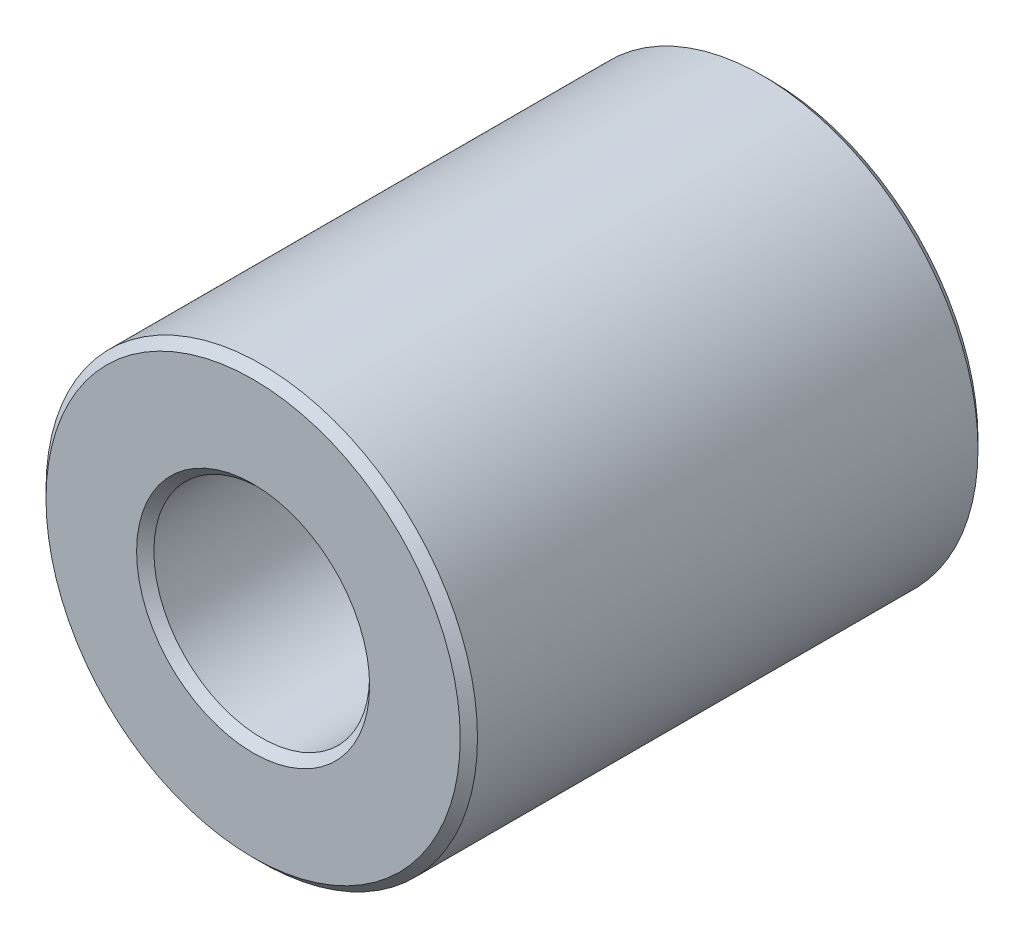
ISO-10303-21;
HEADER;
FILE_DESCRIPTION(('STEP AP214'),'2;1');
FILE_NAME('part.step','',(''),(''),'','','');
FILE_SCHEMA(('AUTOMOTIVE_DESIGN { 1 0 10303 214 1 1 1 1 }'));
ENDSEC;
DATA;
#1=APPLICATION_CONTEXT('core data for automotive mechanical design processes');
#2=APPLICATION_PROTOCOL_DEFINITION('international standard','automotive_design',2000,#1);
#3=PRODUCT_CONTEXT('',#1,'mechanical');
#4=PRODUCT('Part','Part','',(#3));
#5=PRODUCT_RELATED_PRODUCT_CATEGORY('part','',(#4));
#6=PRODUCT_DEFINITION_FORMATION('','',#4);
#7=PRODUCT_DEFINITION_CONTEXT('part definition',#1,'design');
#8=PRODUCT_DEFINITION('design','',#6,#7);
#9=PRODUCT_DEFINITION_SHAPE('','',#8);
#10=(LENGTH_UNIT() NAMED_UNIT(*) SI_UNIT(.MILLI.,.METRE.));
#11=(NAMED_UNIT(*) PLANE_ANGLE_UNIT() SI_UNIT($,.RADIAN.));
#12=(NAMED_UNIT(*) SI_UNIT($,.STERADIAN.) SOLID_ANGLE_UNIT());
#13=UNCERTAINTY_MEASURE_WITH_UNIT(LENGTH_MEASURE(1.E-05),#10,'distance_accuracy_value','');
#14=(GEOMETRIC_REPRESENTATION_CONTEXT(3) GLOBAL_UNCERTAINTY_ASSIGNED_CONTEXT((#13)) GLOBAL_UNIT_ASSIGNED_CONTEXT((#10,
#11,#12)) REPRESENTATION_CONTEXT('',''));
#15=CARTESIAN_POINT('',(0.,0.,0.));
#16=DIRECTION('',(0.,0.,1.));
#17=DIRECTION('',(1.,0.,0.));
#18=AXIS2_PLACEMENT_3D('',#15,#16,#17);
#19=CARTESIAN_POINT('',(0.,0.,60.));
#20=DIRECTION('',(0.,0.,1.));
#21=DIRECTION('',(1.,0.,0.));
#22=AXIS2_PLACEMENT_3D('',#19,#20,#21);
#23=PLANE('',#22);
#24=CARTESIAN_POINT('',(0.,0.,60.));
#25=DIRECTION('',(0.,0.,1.));
#26=DIRECTION('',(1.,0.,0.));
#27=AXIS2_PLACEMENT_3D('',#24,#25,#26);
#28=CIRCLE('',#27,13.5);
#29=CARTESIAN_POINT('',(13.5,0.,60.));
#30=VERTEX_POINT('',#29);
#31=EDGE_CURVE('E10',#30,#30,#28,.F.);
#32=ORIENTED_EDGE('',*,*,#31,.T.);
#33=EDGE_LOOP('',(#32));
#34=FACE_BOUND('',#33,.T.);
#35=CARTESIAN_POINT('',(0.,0.,60.));
#36=DIRECTION('',(0.,0.,1.));
#37=DIRECTION('',(1.,0.,0.));
#38=AXIS2_PLACEMENT_3D('',#35,#36,#37);
#39=CIRCLE('',#38,24.);
#40=CARTESIAN_POINT('',(24.,0.,60.));
#41=VERTEX_POINT('',#40);
#42=EDGE_CURVE('E54',#41,#41,#39,.T.);
#43=ORIENTED_EDGE('',*,*,#42,.T.);
#44=EDGE_LOOP('',(#43));
#45=FACE_BOUND('',#44,.T.);
#46=ADVANCED_FACE('F45',(#34,#45),#23,.T.);
#47=CARTESIAN_POINT('',(0.,0.,0.));
#48=DIRECTION('',(0.,0.,1.));
#49=DIRECTION('',(1.,0.,0.));
#50=AXIS2_PLACEMENT_3D('',#47,#48,#49);
#51=PLANE('',#50);
#52=CARTESIAN_POINT('',(0.,0.,0.));
#53=DIRECTION('',(0.,0.,1.));
#54=DIRECTION('',(1.,0.,0.));
#55=AXIS2_PLACEMENT_3D('',#52,#53,#54);
#56=CIRCLE('',#55,13.5);
#57=CARTESIAN_POINT('',(13.5,0.,0.));
#58=VERTEX_POINT('',#57);
#59=EDGE_CURVE('E78',#58,#58,#56,.T.);
#60=ORIENTED_EDGE('',*,*,#59,.T.);
#61=EDGE_LOOP('',(#60));
#62=FACE_BOUND('',#61,.T.);
#63=CARTESIAN_POINT('',(0.,0.,0.));
#64=DIRECTION('',(0.,0.,1.));
#65=DIRECTION('',(1.,0.,0.));
#66=AXIS2_PLACEMENT_3D('',#63,#64,#65);
#67=CIRCLE('',#66,24.);
#68=CARTESIAN_POINT('',(24.,0.,0.));
#69=VERTEX_POINT('',#68);
#70=EDGE_CURVE('E82',#69,#69,#67,.F.);
#71=ORIENTED_EDGE('',*,*,#70,.T.);
#72=EDGE_LOOP('',(#71));
#73=FACE_BOUND('',#72,.T.);
#74=ADVANCED_FACE('F87',(#62,#73),#51,.F.);
#75=CARTESIAN_POINT('',(0.,0.,60.));
#76=DIRECTION('',(0.,0.,-1.));
#77=DIRECTION('',(-1.,0.,0.));
#78=AXIS2_PLACEMENT_3D('',#75,#76,#77);
#79=CYLINDRICAL_SURFACE('',#78,25.);
#80=CARTESIAN_POINT('',(0.,0.,0.999999999999987));
#81=DIRECTION('',(0.,0.,1.));
#82=DIRECTION('',(1.,0.,0.));
#83=AXIS2_PLACEMENT_3D('',#80,#81,#82);
#84=CIRCLE('',#83,25.);
#85=CARTESIAN_POINT('',(25.,0.,0.999999999999987));
#86=VERTEX_POINT('',#85);
#87=EDGE_CURVE('E59',#86,#86,#84,.T.);
#88=ORIENTED_EDGE('',*,*,#87,.T.);
#89=EDGE_LOOP('',(#88));
#90=FACE_BOUND('',#89,.T.);
#91=CARTESIAN_POINT('',(0.,0.,59.));
#92=DIRECTION('',(0.,0.,1.));
#93=DIRECTION('',(1.,0.,0.));
#94=AXIS2_PLACEMENT_3D('',#91,#92,#93);
#95=CIRCLE('',#94,25.);
#96=CARTESIAN_POINT('',(25.,0.,59.));
#97=VERTEX_POINT('',#96);
#98=EDGE_CURVE('E64',#97,#97,#95,.F.);
#99=ORIENTED_EDGE('',*,*,#98,.T.);
#100=EDGE_LOOP('',(#99));
#101=FACE_BOUND('',#100,.T.);
#102=ADVANCED_FACE('F97',(#90,#101),#79,.T.);
#103=CARTESIAN_POINT('',(0.,0.,60.));
#104=DIRECTION('',(0.,0.,-1.));
#105=DIRECTION('',(-1.,0.,0.));
#106=AXIS2_PLACEMENT_3D('',#103,#104,#105);
#107=CYLINDRICAL_SURFACE('',#106,12.5);
#108=CARTESIAN_POINT('',(0.,0.,1.));
#109=DIRECTION('',(0.,0.,1.));
#110=DIRECTION('',(1.,0.,0.));
#111=AXIS2_PLACEMENT_3D('',#108,#109,#110);
#112=CIRCLE('',#111,12.5);
#113=CARTESIAN_POINT('',(12.5,0.,1.));
#114=VERTEX_POINT('',#113);
#115=EDGE_CURVE('E70',#114,#114,#112,.F.);
#116=ORIENTED_EDGE('',*,*,#115,.T.);
#117=EDGE_LOOP('',(#116));
#118=FACE_BOUND('',#117,.T.);
#119=CARTESIAN_POINT('',(0.,0.,59.));
#120=DIRECTION('',(0.,0.,1.));
#121=DIRECTION('',(1.,0.,0.));
#122=AXIS2_PLACEMENT_3D('',#119,#120,#121);
#123=CIRCLE('',#122,12.5);
#124=CARTESIAN_POINT('',(12.5,0.,59.));
#125=VERTEX_POINT('',#124);
#126=EDGE_CURVE('E74',#125,#125,#123,.T.);
#127=ORIENTED_EDGE('',*,*,#126,.T.);
#128=EDGE_LOOP('',(#127));
#129=FACE_BOUND('',#128,.T.);
#130=ADVANCED_FACE('F100',(#118,#129),#107,.F.);
#131=CARTESIAN_POINT('',(0.,0.,0.));
#132=DIRECTION('',(0.,0.,-1.));
#133=DIRECTION('',(-1.,0.,0.));
#134=AXIS2_PLACEMENT_3D('',#131,#132,#133);
#135=CONICAL_SURFACE('',#134,13.5,0.785398163397454);
#136=ORIENTED_EDGE('',*,*,#115,.F.);
#137=EDGE_LOOP('',(#136));
#138=FACE_BOUND('',#137,.T.);
#139=ORIENTED_EDGE('',*,*,#59,.F.);
#140=EDGE_LOOP('',(#139));
#141=FACE_BOUND('',#140,.T.);
#142=ADVANCED_FACE('F93',(#138,#141),#135,.F.);
#143=CARTESIAN_POINT('',(0.,0.,0.999999999999987));
#144=DIRECTION('',(0.,0.,1.));
#145=DIRECTION('',(1.,0.,0.));
#146=AXIS2_PLACEMENT_3D('',#143,#144,#145);
#147=CONICAL_SURFACE('',#146,25.,0.785398163397448);
#148=ORIENTED_EDGE('',*,*,#70,.F.);
#149=EDGE_LOOP('',(#148));
#150=FACE_BOUND('',#149,.T.);
#151=ORIENTED_EDGE('',*,*,#87,.F.);
#152=EDGE_LOOP('',(#151));
#153=FACE_BOUND('',#152,.T.);
#154=ADVANCED_FACE('F89',(#150,#153),#147,.T.);
#155=CARTESIAN_POINT('',(0.,0.,59.));
#156=DIRECTION('',(0.,0.,1.));
#157=DIRECTION('',(1.,0.,0.));
#158=AXIS2_PLACEMENT_3D('',#155,#156,#157);
#159=CONICAL_SURFACE('',#158,12.5,0.785398163397453);
#160=ORIENTED_EDGE('',*,*,#31,.F.);
#161=EDGE_LOOP('',(#160));
#162=FACE_BOUND('',#161,.T.);
#163=ORIENTED_EDGE('',*,*,#126,.F.);
#164=EDGE_LOOP('',(#163));
#165=FACE_BOUND('',#164,.T.);
#166=ADVANCED_FACE('F92',(#162,#165),#159,.F.);
#167=CARTESIAN_POINT('',(0.,0.,60.));
#168=DIRECTION('',(0.,0.,-1.));
#169=DIRECTION('',(-1.,0.,0.));
#170=AXIS2_PLACEMENT_3D('',#167,#168,#169);
#171=CONICAL_SURFACE('',#170,24.,0.785398163397445);
#172=ORIENTED_EDGE('',*,*,#98,.F.);
#173=EDGE_LOOP('',(#172));
#174=FACE_BOUND('',#173,.T.);
#175=ORIENTED_EDGE('',*,*,#42,.F.);
#176=EDGE_LOOP('',(#175));
#177=FACE_BOUND('',#176,.T.);
#178=ADVANCED_FACE('F48',(#174,#177),#171,.T.);
#179=CLOSED_SHELL('',(#46,#74,#102,#130,#142,#154,#166,#178));
#180=MANIFOLD_SOLID_BREP('B2',#179);
#181=ADVANCED_BREP_SHAPE_REPRESENTATION('',(#18,#180),#14);
#182=SHAPE_DEFINITION_REPRESENTATION(#9,#181);
ENDSEC;
END-ISO-10303-21;
